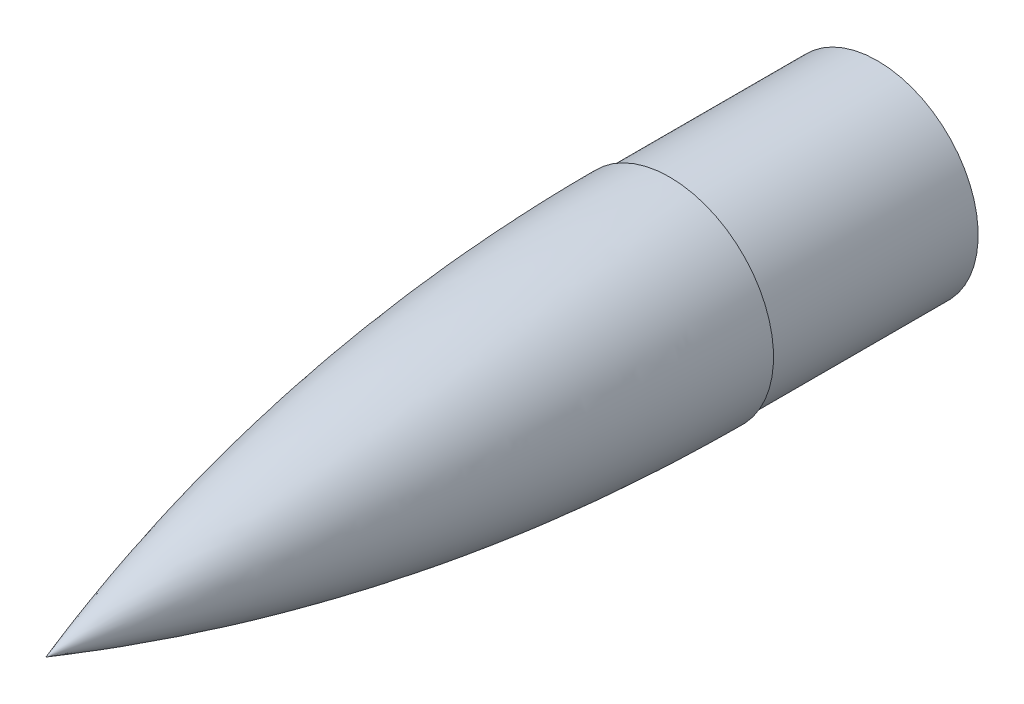
ISO-10303-21;
HEADER;
FILE_DESCRIPTION(('STEP AP214'),'2;1');
FILE_NAME('part.step','',(''),(''),'','','');
FILE_SCHEMA(('AUTOMOTIVE_DESIGN { 1 0 10303 214 1 1 1 1 }'));
ENDSEC;
DATA;
#1=APPLICATION_CONTEXT('core data for automotive mechanical design processes');
#2=APPLICATION_PROTOCOL_DEFINITION('international standard','automotive_design',2000,#1);
#3=PRODUCT_CONTEXT('',#1,'mechanical');
#4=PRODUCT('Part','Part','',(#3));
#5=PRODUCT_RELATED_PRODUCT_CATEGORY('part','',(#4));
#6=PRODUCT_DEFINITION_FORMATION('','',#4);
#7=PRODUCT_DEFINITION_CONTEXT('part definition',#1,'design');
#8=PRODUCT_DEFINITION('design','',#6,#7);
#9=PRODUCT_DEFINITION_SHAPE('','',#8);
#10=(LENGTH_UNIT() NAMED_UNIT(*) SI_UNIT(.MILLI.,.METRE.));
#11=(NAMED_UNIT(*) PLANE_ANGLE_UNIT() SI_UNIT($,.RADIAN.));
#12=(NAMED_UNIT(*) SI_UNIT($,.STERADIAN.) SOLID_ANGLE_UNIT());
#13=UNCERTAINTY_MEASURE_WITH_UNIT(LENGTH_MEASURE(1.E-05),#10,'distance_accuracy_value','');
#14=(GEOMETRIC_REPRESENTATION_CONTEXT(3) GLOBAL_UNCERTAINTY_ASSIGNED_CONTEXT((#13)) GLOBAL_UNIT_ASSIGNED_CONTEXT((#10,
#11,#12)) REPRESENTATION_CONTEXT('',''));
#15=CARTESIAN_POINT('',(0.,0.,0.));
#16=DIRECTION('',(0.,0.,1.));
#17=DIRECTION('',(1.,0.,0.));
#18=AXIS2_PLACEMENT_3D('',#15,#16,#17);
#19=CARTESIAN_POINT('',(0.,50.8000000016972,7.1781941417491E-12));
#20=CARTESIAN_POINT('',(0.,50.8000000016947,0.441435733238004));
#21=CARTESIAN_POINT('',(0.,50.7992072377339,1.33031508219364));
#22=CARTESIAN_POINT('',(0.,50.7956397999016,3.23486785539774));
#23=CARTESIAN_POINT('',(0.,50.7861266564381,5.29202712438508));
#24=CARTESIAN_POINT('',(0.,50.7718570014293,7.39192755228669));
#25=CARTESIAN_POINT('',(0.,50.7528309070987,9.51685582355529));
#26=CARTESIAN_POINT('',(0.,50.7320212744125,11.3639516054526));
#27=CARTESIAN_POINT('',(0.,50.7042753181768,13.4780427384226));
#28=CARTESIAN_POINT('',(0.,50.6715944465389,15.6039166094981));
#29=CARTESIAN_POINT('',(0.,50.6338912202401,17.7410548237269));
#30=CARTESIAN_POINT('',(0.,50.5739443250443,20.6941543684846));
#31=CARTESIAN_POINT('',(0.,50.4982272595092,23.9344932717121));
#32=CARTESIAN_POINT('',(0.,50.3660265487409,28.7945615535912));
#33=CARTESIAN_POINT('',(0.,50.1140309618838,36.3532821874584));
#34=CARTESIAN_POINT('',(0.,49.6547375413511,47.147849790197));
#35=CARTESIAN_POINT('',(0.,48.1343055993842,74.116427434052));
#36=CARTESIAN_POINT('',(0.,44.0822481554571,118.245048390212));
#37=CARTESIAN_POINT('',(0.,35.2039449517995,177.061866435673));
#38=CARTESIAN_POINT('',(0.,22.6140329174379,231.321588698104));
#39=CARTESIAN_POINT('',(0.,11.7712029453835,268.688556223908));
#40=CARTESIAN_POINT('',(0.,5.67735517375053,287.712339912741));
#41=CARTESIAN_POINT('',(0.,5.02063427568979,289.746498303913));
#42=CARTESIAN_POINT('',(0.,4.36289918748529,291.768115861521));
#43=CARTESIAN_POINT('',(0.,3.70407403762402,293.777683440879));
#44=CARTESIAN_POINT('',(0.,3.04196091096861,295.782175928705));
#45=CARTESIAN_POINT('',(0.,2.37062228274376,297.798910734456));
#46=CARTESIAN_POINT('',(0.,1.7036161172071,299.7883434988));
#47=CARTESIAN_POINT('',(0.,1.0442243594819,301.740901659114));
#48=CARTESIAN_POINT('',(0.,0.430899344956986,303.540765887737));
#49=CARTESIAN_POINT('',(0.,0.143168365544436,304.382425600541));
#50=CARTESIAN_POINT('',(0.,-8.83029595887459E-12,304.800000000063));
#51=B_SPLINE_CURVE_WITH_KNOTS('',4,(#19,#20,#21,#22,#23,#24,#25,#26,#27,#28,#29,#30,#31,#32,#33,
#34,#35,#36,#37,#38,#39,#40,#41,#42,#43,#44,#45,#46,#47,#48,#49,#50),.UNSPECIFIED.,.F.,.F.,(5,1,
1,1,1,1,1,1,1,1,1,1,1,1,1,1,1,1,1,1,1,1,1,1,1,1,1,1,5),(0.0828357436616542,0.0885241019530998,
0.0942124602445455,0.0999008185359911,0.105589176827437,0.111277535118882,0.116965893410328,
0.119810072556051,0.128342609993219,0.134156139952094,0.13996966991097,0.15159672982872,
0.16322378974647,0.186477909491859,0.221359088974776,0.267867328355001,0.45390028917293,
0.663187366221216,0.860847386462381,0.866660916654362,0.872474446846344,0.878162805911924,
0.883851164977504,0.889539524043085,0.895227883108665,0.900916242174245,0.906604601239826,
0.912292960305406,0.917981319370986),.UNSPECIFIED.);
#52=CARTESIAN_POINT('',(0.,0.,0.));
#53=DIRECTION('',(0.,0.,-1.));
#54=AXIS1_PLACEMENT('',#52,#53);
#55=SURFACE_OF_REVOLUTION('',#51,#54);
#56=CARTESIAN_POINT('',(0.,0.,304.800000000037));
#57=VERTEX_POINT('',#56);
#58=VERTEX_LOOP('',#57);
#59=FACE_BOUND('',#58,.T.);
#60=CARTESIAN_POINT('',(0.,0.,0.));
#61=DIRECTION('',(0.,0.,-1.));
#62=DIRECTION('',(0.,1.,0.));
#63=AXIS2_PLACEMENT_3D('',#60,#61,#62);
#64=CIRCLE('',#63,50.8000000015649);
#65=CARTESIAN_POINT('',(0.,50.8000000015649,0.));
#66=VERTEX_POINT('',#65);
#67=EDGE_CURVE('E11',#66,#66,#64,.T.);
#68=ORIENTED_EDGE('',*,*,#67,.F.);
#69=EDGE_LOOP('',(#68));
#70=FACE_BOUND('',#69,.T.);
#71=ADVANCED_FACE('F36',(#59,#70),#55,.F.);
#72=CARTESIAN_POINT('',(0.,50.8000000015649,0.));
#73=DIRECTION('',(0.,0.,-1.));
#74=DIRECTION('',(0.,1.,0.));
#75=AXIS2_PLACEMENT_3D('',#72,#73,#74);
#76=PLANE('',#75);
#77=CARTESIAN_POINT('',(0.,0.,0.));
#78=DIRECTION('',(0.,0.,-1.));
#79=DIRECTION('',(0.,1.,0.));
#80=AXIS2_PLACEMENT_3D('',#77,#78,#79);
#81=CIRCLE('',#80,49.2125);
#82=CARTESIAN_POINT('',(0.,49.2125,0.));
#83=VERTEX_POINT('',#82);
#84=EDGE_CURVE('E44',#83,#83,#81,.T.);
#85=ORIENTED_EDGE('',*,*,#84,.F.);
#86=EDGE_LOOP('',(#85));
#87=FACE_BOUND('',#86,.T.);
#88=ORIENTED_EDGE('',*,*,#67,.T.);
#89=EDGE_LOOP('',(#88));
#90=FACE_BOUND('',#89,.T.);
#91=ADVANCED_FACE('F50',(#87,#90),#76,.T.);
#92=CARTESIAN_POINT('',(0.,0.,-50.8));
#93=DIRECTION('',(0.,0.,1.));
#94=DIRECTION('',(0.,-1.,0.));
#95=AXIS2_PLACEMENT_3D('',#92,#93,#94);
#96=CYLINDRICAL_SURFACE('',#95,49.2125);
#97=ORIENTED_EDGE('',*,*,#84,.T.);
#98=EDGE_LOOP('',(#97));
#99=FACE_BOUND('',#98,.T.);
#100=CARTESIAN_POINT('',(0.,0.,-101.6));
#101=DIRECTION('',(0.,0.,-1.));
#102=DIRECTION('',(0.,1.,0.));
#103=AXIS2_PLACEMENT_3D('',#100,#101,#102);
#104=CIRCLE('',#103,49.2125);
#105=CARTESIAN_POINT('',(0.,49.2125,-101.6));
#106=VERTEX_POINT('',#105);
#107=EDGE_CURVE('E90',#106,#106,#104,.T.);
#108=ORIENTED_EDGE('',*,*,#107,.F.);
#109=EDGE_LOOP('',(#108));
#110=FACE_BOUND('',#109,.T.);
#111=ADVANCED_FACE('F54',(#99,#110),#96,.T.);
#112=CARTESIAN_POINT('',(0.,0.,-101.6));
#113=DIRECTION('',(0.,0.,-1.));
#114=DIRECTION('',(0.,1.,0.));
#115=AXIS2_PLACEMENT_3D('',#112,#113,#114);
#116=PLANE('',#115);
#117=CARTESIAN_POINT('',(25.4,0.,-101.6));
#118=DIRECTION('',(0.,0.,-1.));
#119=DIRECTION('',(0.,1.,0.));
#120=AXIS2_PLACEMENT_3D('',#117,#118,#119);
#121=CIRCLE('',#120,9.525);
#122=CARTESIAN_POINT('',(25.4,9.52500000000001,-101.6));
#123=VERTEX_POINT('',#122);
#124=EDGE_CURVE('E94',#123,#123,#121,.T.);
#125=ORIENTED_EDGE('',*,*,#124,.F.);
#126=EDGE_LOOP('',(#125));
#127=FACE_BOUND('',#126,.T.);
#128=ORIENTED_EDGE('',*,*,#107,.T.);
#129=EDGE_LOOP('',(#128));
#130=FACE_BOUND('',#129,.T.);
#131=CARTESIAN_POINT('',(-25.4,0.,-101.6));
#132=DIRECTION('',(0.,0.,-1.));
#133=DIRECTION('',(0.,-1.,0.));
#134=AXIS2_PLACEMENT_3D('',#131,#132,#133);
#135=CIRCLE('',#134,9.525);
#136=CARTESIAN_POINT('',(-25.4,-9.52499999999999,-101.6));
#137=VERTEX_POINT('',#136);
#138=EDGE_CURVE('E83',#137,#137,#135,.T.);
#139=ORIENTED_EDGE('',*,*,#138,.F.);
#140=EDGE_LOOP('',(#139));
#141=FACE_BOUND('',#140,.T.);
#142=ADVANCED_FACE('F59',(#127,#130,#141),#116,.T.);
#143=CARTESIAN_POINT('',(25.4,0.,-101.6));
#144=DIRECTION('',(0.,0.,1.));
#145=DIRECTION('',(0.,-1.,0.));
#146=AXIS2_PLACEMENT_3D('',#143,#144,#145);
#147=CYLINDRICAL_SURFACE('',#146,9.525);
#148=ORIENTED_EDGE('',*,*,#124,.T.);
#149=EDGE_LOOP('',(#148));
#150=FACE_BOUND('',#149,.T.);
#151=CARTESIAN_POINT('',(25.4,0.,-50.8));
#152=DIRECTION('',(0.,0.,-1.));
#153=DIRECTION('',(0.,1.,0.));
#154=AXIS2_PLACEMENT_3D('',#151,#152,#153);
#155=CIRCLE('',#154,9.525);
#156=CARTESIAN_POINT('',(34.925,0.,-50.8));
#157=VERTEX_POINT('',#156);
#158=EDGE_CURVE('E86',#157,#157,#155,.T.);
#159=ORIENTED_EDGE('',*,*,#158,.F.);
#160=EDGE_LOOP('',(#159));
#161=FACE_BOUND('',#160,.T.);
#162=ADVANCED_FACE('F71',(#150,#161),#147,.F.);
#163=CARTESIAN_POINT('',(-25.4,0.,-101.6));
#164=DIRECTION('',(0.,0.,1.));
#165=DIRECTION('',(0.,-1.,0.));
#166=AXIS2_PLACEMENT_3D('',#163,#164,#165);
#167=CYLINDRICAL_SURFACE('',#166,9.525);
#168=ORIENTED_EDGE('',*,*,#138,.T.);
#169=EDGE_LOOP('',(#168));
#170=FACE_BOUND('',#169,.T.);
#171=CARTESIAN_POINT('',(-25.4,0.,-50.8));
#172=DIRECTION('',(0.,0.,-1.));
#173=DIRECTION('',(0.,1.,0.));
#174=AXIS2_PLACEMENT_3D('',#171,#172,#173);
#175=CIRCLE('',#174,9.525);
#176=CARTESIAN_POINT('',(-34.925,0.,-50.8));
#177=VERTEX_POINT('',#176);
#178=EDGE_CURVE('E40',#177,#177,#175,.T.);
#179=ORIENTED_EDGE('',*,*,#178,.F.);
#180=EDGE_LOOP('',(#179));
#181=FACE_BOUND('',#180,.T.);
#182=ADVANCED_FACE('F67',(#170,#181),#167,.F.);
#183=CARTESIAN_POINT('',(0.,0.,-50.8));
#184=DIRECTION('',(0.,1.,0.));
#185=DIRECTION('',(0.,0.,1.));
#186=AXIS2_PLACEMENT_3D('',#183,#184,#185);
#187=TOROIDAL_SURFACE('',#186,25.4,9.525);
#188=CARTESIAN_POINT('',(0.,0.,-50.8));
#189=DIRECTION('',(0.,1.,0.));
#190=DIRECTION('',(0.,0.,1.));
#191=AXIS2_PLACEMENT_3D('',#188,#189,#190);
#192=CIRCLE('',#191,34.925);
#193=EDGE_CURVE('',#177,#157,#192,.T.);
#194=ORIENTED_EDGE('',*,*,#178,.T.);
#195=ORIENTED_EDGE('',*,*,#158,.T.);
#196=ORIENTED_EDGE('',*,*,#193,.T.);
#197=ORIENTED_EDGE('',*,*,#193,.F.);
#198=EDGE_LOOP('',(#194,#196,#195,#197));
#199=FACE_BOUND('',#198,.T.);
#200=ADVANCED_FACE('F64',(#199),#187,.F.);
#201=CLOSED_SHELL('',(#71,#91,#111,#142,#162,#182,#200));
#202=MANIFOLD_SOLID_BREP('B2',#201);
#203=ADVANCED_BREP_SHAPE_REPRESENTATION('',(#18,#202),#14);
#204=SHAPE_DEFINITION_REPRESENTATION(#9,#203);
ENDSEC;
END-ISO-10303-21;
